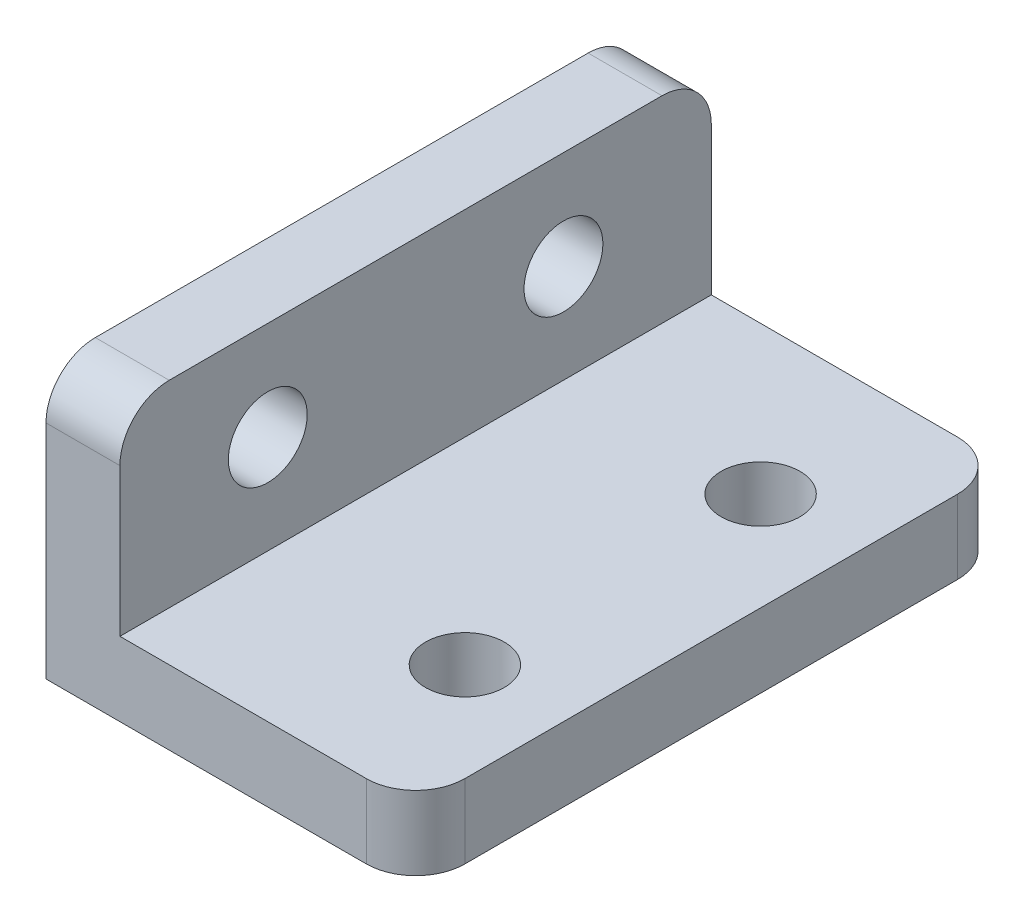
ISO-10303-21;
HEADER;
FILE_DESCRIPTION(('STEP AP214'),'2;1');
FILE_NAME('part.step','',(''),(''),'','','');
FILE_SCHEMA(('AUTOMOTIVE_DESIGN { 1 0 10303 214 1 1 1 1 }'));
ENDSEC;
DATA;
#1=APPLICATION_CONTEXT('core data for automotive mechanical design processes');
#2=APPLICATION_PROTOCOL_DEFINITION('international standard','automotive_design',2000,#1);
#3=PRODUCT_CONTEXT('',#1,'mechanical');
#4=PRODUCT('Part','Part','',(#3));
#5=PRODUCT_RELATED_PRODUCT_CATEGORY('part','',(#4));
#6=PRODUCT_DEFINITION_FORMATION('','',#4);
#7=PRODUCT_DEFINITION_CONTEXT('part definition',#1,'design');
#8=PRODUCT_DEFINITION('design','',#6,#7);
#9=PRODUCT_DEFINITION_SHAPE('','',#8);
#10=(LENGTH_UNIT() NAMED_UNIT(*) SI_UNIT(.MILLI.,.METRE.));
#11=(NAMED_UNIT(*) PLANE_ANGLE_UNIT() SI_UNIT($,.RADIAN.));
#12=(NAMED_UNIT(*) SI_UNIT($,.STERADIAN.) SOLID_ANGLE_UNIT());
#13=UNCERTAINTY_MEASURE_WITH_UNIT(LENGTH_MEASURE(1.E-05),#10,'distance_accuracy_value','');
#14=(GEOMETRIC_REPRESENTATION_CONTEXT(3) GLOBAL_UNCERTAINTY_ASSIGNED_CONTEXT((#13)) GLOBAL_UNIT_ASSIGNED_CONTEXT((#10,
#11,#12)) REPRESENTATION_CONTEXT('',''));
#15=CARTESIAN_POINT('',(0.,0.,0.));
#16=DIRECTION('',(0.,0.,1.));
#17=DIRECTION('',(1.,0.,0.));
#18=AXIS2_PLACEMENT_3D('',#15,#16,#17);
#19=CARTESIAN_POINT('',(9.40836507358763E-13,101.691622654979,-24.));
#20=DIRECTION('',(0.,-1.,0.));
#21=DIRECTION('',(1.,0.,0.));
#22=AXIS2_PLACEMENT_3D('',#19,#20,#21);
#23=PLANE('',#22);
#24=CARTESIAN_POINT('',(14.,101.691622654979,-6.));
#25=DIRECTION('',(0.,-1.,0.));
#26=DIRECTION('',(1.,0.,0.));
#27=AXIS2_PLACEMENT_3D('',#24,#25,#26);
#28=CIRCLE('',#27,1.60000000001785);
#29=CARTESIAN_POINT('',(15.6000000000178,101.691622654979,-6.));
#30=VERTEX_POINT('',#29);
#31=EDGE_CURVE('E369',#30,#30,#28,.T.);
#32=ORIENTED_EDGE('',*,*,#31,.F.);
#33=EDGE_LOOP('',(#32));
#34=FACE_BOUND('',#33,.T.);
#35=CARTESIAN_POINT('',(14.,101.691622654979,-18.));
#36=DIRECTION('',(0.,-1.,0.));
#37=DIRECTION('',(1.,0.,0.));
#38=AXIS2_PLACEMENT_3D('',#35,#36,#37);
#39=CIRCLE('',#38,1.60000000001785);
#40=CARTESIAN_POINT('',(15.6000000000178,101.691622654979,-18.));
#41=VERTEX_POINT('',#40);
#42=EDGE_CURVE('E374',#41,#41,#39,.T.);
#43=ORIENTED_EDGE('',*,*,#42,.F.);
#44=EDGE_LOOP('',(#43));
#45=FACE_BOUND('',#44,.T.);
#46=DIRECTION('',(1.,0.,0.));
#47=VECTOR('',#46,1.);
#48=CARTESIAN_POINT('',(9.40836507358763E-13,101.691622654979,-24.));
#49=LINE('',#48,#47);
#50=CARTESIAN_POINT('',(3.0000000000001,101.691622654979,-24.));
#51=VERTEX_POINT('',#50);
#52=CARTESIAN_POINT('',(16.,101.691622654979,-24.));
#53=VERTEX_POINT('',#52);
#54=EDGE_CURVE('E140',#51,#53,#49,.T.);
#55=ORIENTED_EDGE('',*,*,#54,.T.);
#56=CARTESIAN_POINT('',(16.,101.691622654979,-22.));
#57=DIRECTION('',(0.,-1.,0.));
#58=DIRECTION('',(1.,0.,0.));
#59=AXIS2_PLACEMENT_3D('',#56,#57,#58);
#60=CIRCLE('',#59,2.);
#61=CARTESIAN_POINT('',(18.,101.691622654979,-22.));
#62=VERTEX_POINT('',#61);
#63=EDGE_CURVE('E181',#53,#62,#60,.T.);
#64=ORIENTED_EDGE('',*,*,#63,.T.);
#65=DIRECTION('',(0.,0.,1.));
#66=VECTOR('',#65,1.);
#67=CARTESIAN_POINT('',(18.,101.691622654979,-24.));
#68=LINE('',#67,#66);
#69=CARTESIAN_POINT('',(18.,101.691622654979,-2.));
#70=VERTEX_POINT('',#69);
#71=EDGE_CURVE('E148',#62,#70,#68,.T.);
#72=ORIENTED_EDGE('',*,*,#71,.T.);
#73=CARTESIAN_POINT('',(16.,101.691622654979,-2.));
#74=DIRECTION('',(0.,-1.,0.));
#75=DIRECTION('',(1.,0.,0.));
#76=AXIS2_PLACEMENT_3D('',#73,#74,#75);
#77=CIRCLE('',#76,2.);
#78=CARTESIAN_POINT('',(16.,101.691622654979,0.));
#79=VERTEX_POINT('',#78);
#80=EDGE_CURVE('E179',#70,#79,#77,.T.);
#81=ORIENTED_EDGE('',*,*,#80,.T.);
#82=DIRECTION('',(1.,0.,0.));
#83=VECTOR('',#82,1.);
#84=CARTESIAN_POINT('',(9.40836507358763E-13,101.691622654979,0.));
#85=LINE('',#84,#83);
#86=CARTESIAN_POINT('',(3.0000000000001,101.691622654979,0.));
#87=VERTEX_POINT('',#86);
#88=EDGE_CURVE('E149',#87,#79,#85,.T.);
#89=ORIENTED_EDGE('',*,*,#88,.F.);
#90=DIRECTION('',(0.,0.,1.));
#91=VECTOR('',#90,1.);
#92=CARTESIAN_POINT('',(3.0000000000001,101.691622654979,-24.));
#93=LINE('',#92,#91);
#94=EDGE_CURVE('E157',#51,#87,#93,.T.);
#95=ORIENTED_EDGE('',*,*,#94,.F.);
#96=EDGE_LOOP('',(#55,#64,#72,#81,#89,#95));
#97=FACE_BOUND('',#96,.T.);
#98=ADVANCED_FACE('F36',(#34,#45,#97),#23,.T.);
#99=CARTESIAN_POINT('',(3.00000000000058,0.,-24.));
#100=DIRECTION('',(-1.,0.,0.));
#101=DIRECTION('',(0.,-1.,0.));
#102=AXIS2_PLACEMENT_3D('',#99,#100,#101);
#103=PLANE('',#102);
#104=CARTESIAN_POINT('',(3.00000000000007,108.691622654979,-6.));
#105=DIRECTION('',(-1.,0.,0.));
#106=DIRECTION('',(0.,-1.,0.));
#107=AXIS2_PLACEMENT_3D('',#104,#105,#106);
#108=CIRCLE('',#107,1.60000000000001);
#109=CARTESIAN_POINT('',(3.00000000000008,107.091622654979,-6.));
#110=VERTEX_POINT('',#109);
#111=EDGE_CURVE('E153',#110,#110,#108,.T.);
#112=ORIENTED_EDGE('',*,*,#111,.F.);
#113=EDGE_LOOP('',(#112));
#114=FACE_BOUND('',#113,.T.);
#115=CARTESIAN_POINT('',(3.00000000000007,108.691622654979,-18.));
#116=DIRECTION('',(-1.,0.,0.));
#117=DIRECTION('',(0.,-1.,0.));
#118=AXIS2_PLACEMENT_3D('',#115,#116,#117);
#119=CIRCLE('',#118,1.60000000000001);
#120=CARTESIAN_POINT('',(3.00000000000008,107.091622654979,-18.));
#121=VERTEX_POINT('',#120);
#122=EDGE_CURVE('E371',#121,#121,#119,.T.);
#123=ORIENTED_EDGE('',*,*,#122,.F.);
#124=EDGE_LOOP('',(#123));
#125=FACE_BOUND('',#124,.T.);
#126=DIRECTION('',(0.,0.,1.));
#127=VECTOR('',#126,1.);
#128=CARTESIAN_POINT('',(3.00000000000005,112.691622654979,-24.));
#129=LINE('',#128,#127);
#130=CARTESIAN_POINT('',(3.00000000000005,112.691622654979,-22.));
#131=VERTEX_POINT('',#130);
#132=CARTESIAN_POINT('',(3.00000000000005,112.691622654979,-2.));
#133=VERTEX_POINT('',#132);
#134=EDGE_CURVE('E161',#131,#133,#129,.T.);
#135=ORIENTED_EDGE('',*,*,#134,.F.);
#136=CARTESIAN_POINT('',(3.00000000000006,110.691622654979,-22.));
#137=DIRECTION('',(-1.,0.,0.));
#138=DIRECTION('',(0.,-1.,0.));
#139=AXIS2_PLACEMENT_3D('',#136,#137,#138);
#140=CIRCLE('',#139,2.);
#141=CARTESIAN_POINT('',(3.00000000000006,110.691622654979,-24.));
#142=VERTEX_POINT('',#141);
#143=EDGE_CURVE('E11',#131,#142,#140,.T.);
#144=ORIENTED_EDGE('',*,*,#143,.T.);
#145=DIRECTION('',(0.,-1.,0.));
#146=VECTOR('',#145,1.);
#147=CARTESIAN_POINT('',(3.00000000000058,0.,-24.));
#148=LINE('',#147,#146);
#149=EDGE_CURVE('E124',#142,#51,#148,.T.);
#150=ORIENTED_EDGE('',*,*,#149,.T.);
#151=ORIENTED_EDGE('',*,*,#94,.T.);
#152=DIRECTION('',(0.,-1.,0.));
#153=VECTOR('',#152,1.);
#154=CARTESIAN_POINT('',(3.00000000000058,0.,0.));
#155=LINE('',#154,#153);
#156=CARTESIAN_POINT('',(3.00000000000006,110.691622654979,0.));
#157=VERTEX_POINT('',#156);
#158=EDGE_CURVE('E143',#157,#87,#155,.T.);
#159=ORIENTED_EDGE('',*,*,#158,.F.);
#160=CARTESIAN_POINT('',(3.00000000000006,110.691622654979,-2.));
#161=DIRECTION('',(-1.,0.,0.));
#162=DIRECTION('',(0.,-1.,0.));
#163=AXIS2_PLACEMENT_3D('',#160,#161,#162);
#164=CIRCLE('',#163,2.);
#165=EDGE_CURVE('E44',#157,#133,#164,.T.);
#166=ORIENTED_EDGE('',*,*,#165,.T.);
#167=EDGE_LOOP('',(#135,#144,#150,#151,#159,#166));
#168=FACE_BOUND('',#167,.T.);
#169=ADVANCED_FACE('F201',(#114,#125,#168),#103,.T.);
#170=CARTESIAN_POINT('',(0.,112.691622654979,-24.));
#171=DIRECTION('',(0.,-1.,0.));
#172=DIRECTION('',(0.,0.,-1.));
#173=AXIS2_PLACEMENT_3D('',#170,#171,#172);
#174=PLANE('',#173);
#175=DIRECTION('',(0.,0.,1.));
#176=VECTOR('',#175,1.);
#177=CARTESIAN_POINT('',(6.00000000000005,112.691622654979,-24.));
#178=LINE('',#177,#176);
#179=CARTESIAN_POINT('',(6.00000000000005,112.691622654979,-22.));
#180=VERTEX_POINT('',#179);
#181=CARTESIAN_POINT('',(6.00000000000005,112.691622654979,-2.));
#182=VERTEX_POINT('',#181);
#183=EDGE_CURVE('E134',#180,#182,#178,.T.);
#184=ORIENTED_EDGE('',*,*,#183,.F.);
#185=DIRECTION('',(1.,0.,0.));
#186=VECTOR('',#185,1.);
#187=CARTESIAN_POINT('',(0.,112.691622654979,-22.));
#188=LINE('',#187,#186);
#189=EDGE_CURVE('E57',#180,#131,#188,.F.);
#190=ORIENTED_EDGE('',*,*,#189,.T.);
#191=ORIENTED_EDGE('',*,*,#134,.T.);
#192=DIRECTION('',(1.,0.,0.));
#193=VECTOR('',#192,1.);
#194=CARTESIAN_POINT('',(6.00000000000005,112.691622654979,-2.));
#195=LINE('',#194,#193);
#196=EDGE_CURVE('E192',#133,#182,#195,.T.);
#197=ORIENTED_EDGE('',*,*,#196,.T.);
#198=EDGE_LOOP('',(#184,#190,#191,#197));
#199=FACE_BOUND('',#198,.T.);
#200=ADVANCED_FACE('F196',(#199),#174,.F.);
#201=CARTESIAN_POINT('',(6.00000000000006,0.,-24.));
#202=DIRECTION('',(-1.,0.,0.));
#203=DIRECTION('',(0.,-1.,0.));
#204=AXIS2_PLACEMENT_3D('',#201,#202,#203);
#205=PLANE('',#204);
#206=CARTESIAN_POINT('',(6.00000000000005,108.691622654979,-6.));
#207=DIRECTION('',(1.,0.,0.));
#208=DIRECTION('',(0.,1.,0.));
#209=AXIS2_PLACEMENT_3D('',#206,#207,#208);
#210=CIRCLE('',#209,1.60000000000001);
#211=CARTESIAN_POINT('',(6.00000000000005,110.291622654979,-6.));
#212=VERTEX_POINT('',#211);
#213=EDGE_CURVE('E364',#212,#212,#210,.T.);
#214=ORIENTED_EDGE('',*,*,#213,.F.);
#215=EDGE_LOOP('',(#214));
#216=FACE_BOUND('',#215,.T.);
#217=CARTESIAN_POINT('',(6.00000000000005,108.691622654979,-18.));
#218=DIRECTION('',(1.,0.,0.));
#219=DIRECTION('',(0.,1.,0.));
#220=AXIS2_PLACEMENT_3D('',#217,#218,#219);
#221=CIRCLE('',#220,1.60000000000001);
#222=CARTESIAN_POINT('',(6.00000000000005,110.291622654979,-18.));
#223=VERTEX_POINT('',#222);
#224=EDGE_CURVE('E367',#223,#223,#221,.T.);
#225=ORIENTED_EDGE('',*,*,#224,.F.);
#226=EDGE_LOOP('',(#225));
#227=FACE_BOUND('',#226,.T.);
#228=DIRECTION('',(0.,-1.,0.));
#229=VECTOR('',#228,1.);
#230=CARTESIAN_POINT('',(6.00000000000006,0.,-24.));
#231=LINE('',#230,#229);
#232=CARTESIAN_POINT('',(6.00000000000005,110.691622654979,-24.));
#233=VERTEX_POINT('',#232);
#234=CARTESIAN_POINT('',(6.00000000000005,104.691622654979,-24.));
#235=VERTEX_POINT('',#234);
#236=EDGE_CURVE('E114',#233,#235,#231,.T.);
#237=ORIENTED_EDGE('',*,*,#236,.F.);
#238=CARTESIAN_POINT('',(6.00000000000005,110.691622654979,-22.));
#239=DIRECTION('',(-1.,0.,0.));
#240=DIRECTION('',(0.,-1.,0.));
#241=AXIS2_PLACEMENT_3D('',#238,#239,#240);
#242=CIRCLE('',#241,2.);
#243=EDGE_CURVE('E190',#233,#180,#242,.F.);
#244=ORIENTED_EDGE('',*,*,#243,.T.);
#245=ORIENTED_EDGE('',*,*,#183,.T.);
#246=CARTESIAN_POINT('',(6.00000000000005,110.691622654979,-2.));
#247=DIRECTION('',(-1.,0.,0.));
#248=DIRECTION('',(0.,-1.,0.));
#249=AXIS2_PLACEMENT_3D('',#246,#247,#248);
#250=CIRCLE('',#249,2.);
#251=CARTESIAN_POINT('',(6.00000000000005,110.691622654979,0.));
#252=VERTEX_POINT('',#251);
#253=EDGE_CURVE('E188',#182,#252,#250,.F.);
#254=ORIENTED_EDGE('',*,*,#253,.T.);
#255=DIRECTION('',(0.,-1.,0.));
#256=VECTOR('',#255,1.);
#257=CARTESIAN_POINT('',(6.00000000000006,0.,0.));
#258=LINE('',#257,#256);
#259=CARTESIAN_POINT('',(6.00000000000005,104.691622654979,0.));
#260=VERTEX_POINT('',#259);
#261=EDGE_CURVE('E130',#252,#260,#258,.T.);
#262=ORIENTED_EDGE('',*,*,#261,.T.);
#263=DIRECTION('',(0.,0.,1.));
#264=VECTOR('',#263,1.);
#265=CARTESIAN_POINT('',(6.00000000000005,104.691622654979,-24.));
#266=LINE('',#265,#264);
#267=EDGE_CURVE('E127',#235,#260,#266,.T.);
#268=ORIENTED_EDGE('',*,*,#267,.F.);
#269=EDGE_LOOP('',(#237,#244,#245,#254,#262,#268));
#270=FACE_BOUND('',#269,.T.);
#271=ADVANCED_FACE('F128',(#216,#227,#270),#205,.F.);
#272=CARTESIAN_POINT('',(0.,104.691622654979,-24.));
#273=DIRECTION('',(0.,-1.,0.));
#274=DIRECTION('',(0.,0.,-1.));
#275=AXIS2_PLACEMENT_3D('',#272,#273,#274);
#276=PLANE('',#275);
#277=CARTESIAN_POINT('',(14.,104.691622654979,-6.));
#278=DIRECTION('',(0.,1.,0.));
#279=DIRECTION('',(-1.,0.,0.));
#280=AXIS2_PLACEMENT_3D('',#277,#278,#279);
#281=CIRCLE('',#280,1.60000000001785);
#282=CARTESIAN_POINT('',(12.3999999999821,104.691622654979,-6.));
#283=VERTEX_POINT('',#282);
#284=EDGE_CURVE('E386',#283,#283,#281,.T.);
#285=ORIENTED_EDGE('',*,*,#284,.F.);
#286=EDGE_LOOP('',(#285));
#287=FACE_BOUND('',#286,.T.);
#288=CARTESIAN_POINT('',(14.,104.691622654979,-18.));
#289=DIRECTION('',(0.,1.,0.));
#290=DIRECTION('',(-1.,0.,0.));
#291=AXIS2_PLACEMENT_3D('',#288,#289,#290);
#292=CIRCLE('',#291,1.60000000001785);
#293=CARTESIAN_POINT('',(12.3999999999821,104.691622654979,-18.));
#294=VERTEX_POINT('',#293);
#295=EDGE_CURVE('E387',#294,#294,#292,.T.);
#296=ORIENTED_EDGE('',*,*,#295,.F.);
#297=EDGE_LOOP('',(#296));
#298=FACE_BOUND('',#297,.T.);
#299=DIRECTION('',(0.,0.,1.));
#300=VECTOR('',#299,1.);
#301=CARTESIAN_POINT('',(18.,104.691622654979,-24.));
#302=LINE('',#301,#300);
#303=CARTESIAN_POINT('',(18.,104.691622654979,-22.));
#304=VERTEX_POINT('',#303);
#305=CARTESIAN_POINT('',(18.,104.691622654979,-2.));
#306=VERTEX_POINT('',#305);
#307=EDGE_CURVE('E135',#304,#306,#302,.T.);
#308=ORIENTED_EDGE('',*,*,#307,.F.);
#309=CARTESIAN_POINT('',(16.,104.691622654979,-22.));
#310=DIRECTION('',(0.,-1.,0.));
#311=DIRECTION('',(0.,0.,-1.));
#312=AXIS2_PLACEMENT_3D('',#309,#310,#311);
#313=CIRCLE('',#312,2.);
#314=CARTESIAN_POINT('',(16.,104.691622654979,-24.));
#315=VERTEX_POINT('',#314);
#316=EDGE_CURVE('E139',#304,#315,#313,.F.);
#317=ORIENTED_EDGE('',*,*,#316,.T.);
#318=DIRECTION('',(1.,0.,0.));
#319=VECTOR('',#318,1.);
#320=CARTESIAN_POINT('',(0.,104.691622654979,-24.));
#321=LINE('',#320,#319);
#322=EDGE_CURVE('E118',#235,#315,#321,.T.);
#323=ORIENTED_EDGE('',*,*,#322,.F.);
#324=ORIENTED_EDGE('',*,*,#267,.T.);
#325=DIRECTION('',(1.,0.,0.));
#326=VECTOR('',#325,1.);
#327=CARTESIAN_POINT('',(0.,104.691622654979,0.));
#328=LINE('',#327,#326);
#329=CARTESIAN_POINT('',(16.,104.691622654979,0.));
#330=VERTEX_POINT('',#329);
#331=EDGE_CURVE('E152',#260,#330,#328,.T.);
#332=ORIENTED_EDGE('',*,*,#331,.T.);
#333=CARTESIAN_POINT('',(16.,104.691622654979,-2.));
#334=DIRECTION('',(0.,-1.,0.));
#335=DIRECTION('',(0.,0.,-1.));
#336=AXIS2_PLACEMENT_3D('',#333,#334,#335);
#337=CIRCLE('',#336,2.);
#338=EDGE_CURVE('E173',#330,#306,#337,.F.);
#339=ORIENTED_EDGE('',*,*,#338,.T.);
#340=EDGE_LOOP('',(#308,#317,#323,#324,#332,#339));
#341=FACE_BOUND('',#340,.T.);
#342=ADVANCED_FACE('F138',(#287,#298,#341),#276,.F.);
#343=CARTESIAN_POINT('',(18.,0.,-24.));
#344=DIRECTION('',(1.,0.,0.));
#345=DIRECTION('',(0.,0.,-1.));
#346=AXIS2_PLACEMENT_3D('',#343,#344,#345);
#347=PLANE('',#346);
#348=ORIENTED_EDGE('',*,*,#71,.F.);
#349=DIRECTION('',(0.,1.,0.));
#350=VECTOR('',#349,1.);
#351=CARTESIAN_POINT('',(18.,104.691622654979,-22.));
#352=LINE('',#351,#350);
#353=EDGE_CURVE('E170',#62,#304,#352,.T.);
#354=ORIENTED_EDGE('',*,*,#353,.T.);
#355=ORIENTED_EDGE('',*,*,#307,.T.);
#356=DIRECTION('',(0.,1.,0.));
#357=VECTOR('',#356,1.);
#358=CARTESIAN_POINT('',(18.,0.,-2.));
#359=LINE('',#358,#357);
#360=EDGE_CURVE('E160',#306,#70,#359,.F.);
#361=ORIENTED_EDGE('',*,*,#360,.T.);
#362=EDGE_LOOP('',(#348,#354,#355,#361));
#363=FACE_BOUND('',#362,.T.);
#364=ADVANCED_FACE('F212',(#363),#347,.T.);
#365=CARTESIAN_POINT('',(0.,0.,-24.));
#366=DIRECTION('',(0.,0.,1.));
#367=DIRECTION('',(1.,0.,0.));
#368=AXIS2_PLACEMENT_3D('',#365,#366,#367);
#369=PLANE('',#368);
#370=ORIENTED_EDGE('',*,*,#322,.T.);
#371=DIRECTION('',(0.,1.,0.));
#372=VECTOR('',#371,1.);
#373=CARTESIAN_POINT('',(16.,101.691622654979,-24.));
#374=LINE('',#373,#372);
#375=EDGE_CURVE('E177',#315,#53,#374,.F.);
#376=ORIENTED_EDGE('',*,*,#375,.T.);
#377=ORIENTED_EDGE('',*,*,#54,.F.);
#378=ORIENTED_EDGE('',*,*,#149,.F.);
#379=DIRECTION('',(1.,0.,0.));
#380=VECTOR('',#379,1.);
#381=CARTESIAN_POINT('',(0.,110.691622654979,-24.));
#382=LINE('',#381,#380);
#383=EDGE_CURVE('E122',#142,#233,#382,.T.);
#384=ORIENTED_EDGE('',*,*,#383,.T.);
#385=ORIENTED_EDGE('',*,*,#236,.T.);
#386=EDGE_LOOP('',(#370,#376,#377,#378,#384,#385));
#387=FACE_BOUND('',#386,.T.);
#388=ADVANCED_FACE('F116',(#387),#369,.F.);
#389=CARTESIAN_POINT('',(0.,0.,0.));
#390=DIRECTION('',(0.,0.,1.));
#391=DIRECTION('',(1.,0.,0.));
#392=AXIS2_PLACEMENT_3D('',#389,#390,#391);
#393=PLANE('',#392);
#394=ORIENTED_EDGE('',*,*,#88,.T.);
#395=DIRECTION('',(0.,1.,0.));
#396=VECTOR('',#395,1.);
#397=CARTESIAN_POINT('',(16.,0.,0.));
#398=LINE('',#397,#396);
#399=EDGE_CURVE('E185',#79,#330,#398,.T.);
#400=ORIENTED_EDGE('',*,*,#399,.T.);
#401=ORIENTED_EDGE('',*,*,#331,.F.);
#402=ORIENTED_EDGE('',*,*,#261,.F.);
#403=DIRECTION('',(1.,0.,0.));
#404=VECTOR('',#403,1.);
#405=CARTESIAN_POINT('',(3.00000000000005,110.691622654979,0.));
#406=LINE('',#405,#404);
#407=EDGE_CURVE('E183',#252,#157,#406,.F.);
#408=ORIENTED_EDGE('',*,*,#407,.T.);
#409=ORIENTED_EDGE('',*,*,#158,.T.);
#410=EDGE_LOOP('',(#394,#400,#401,#402,#408,#409));
#411=FACE_BOUND('',#410,.T.);
#412=ADVANCED_FACE('F219',(#411),#393,.T.);
#413=CARTESIAN_POINT('',(-18.,108.691622654979,-18.));
#414=DIRECTION('',(1.,0.,0.));
#415=DIRECTION('',(0.,1.,0.));
#416=AXIS2_PLACEMENT_3D('',#413,#414,#415);
#417=CYLINDRICAL_SURFACE('',#416,1.60000000000001);
#418=ORIENTED_EDGE('',*,*,#122,.T.);
#419=EDGE_LOOP('',(#418));
#420=FACE_BOUND('',#419,.T.);
#421=ORIENTED_EDGE('',*,*,#224,.T.);
#422=EDGE_LOOP('',(#421));
#423=FACE_BOUND('',#422,.T.);
#424=ADVANCED_FACE('F289',(#420,#423),#417,.F.);
#425=CARTESIAN_POINT('',(-18.,108.691622654979,-6.));
#426=DIRECTION('',(1.,0.,0.));
#427=DIRECTION('',(0.,1.,0.));
#428=AXIS2_PLACEMENT_3D('',#425,#426,#427);
#429=CYLINDRICAL_SURFACE('',#428,1.60000000000001);
#430=ORIENTED_EDGE('',*,*,#111,.T.);
#431=EDGE_LOOP('',(#430));
#432=FACE_BOUND('',#431,.T.);
#433=ORIENTED_EDGE('',*,*,#213,.T.);
#434=EDGE_LOOP('',(#433));
#435=FACE_BOUND('',#434,.T.);
#436=ADVANCED_FACE('F280',(#432,#435),#429,.F.);
#437=CARTESIAN_POINT('',(14.,80.6916226549791,-18.));
#438=DIRECTION('',(0.,1.,0.));
#439=DIRECTION('',(-1.,0.,0.));
#440=AXIS2_PLACEMENT_3D('',#437,#438,#439);
#441=CYLINDRICAL_SURFACE('',#440,1.60000000001785);
#442=ORIENTED_EDGE('',*,*,#42,.T.);
#443=EDGE_LOOP('',(#442));
#444=FACE_BOUND('',#443,.T.);
#445=ORIENTED_EDGE('',*,*,#295,.T.);
#446=EDGE_LOOP('',(#445));
#447=FACE_BOUND('',#446,.T.);
#448=ADVANCED_FACE('F271',(#444,#447),#441,.F.);
#449=CARTESIAN_POINT('',(14.,80.6916226549791,-6.));
#450=DIRECTION('',(0.,1.,0.));
#451=DIRECTION('',(-1.,0.,0.));
#452=AXIS2_PLACEMENT_3D('',#449,#450,#451);
#453=CYLINDRICAL_SURFACE('',#452,1.60000000001785);
#454=ORIENTED_EDGE('',*,*,#31,.T.);
#455=EDGE_LOOP('',(#454));
#456=FACE_BOUND('',#455,.T.);
#457=ORIENTED_EDGE('',*,*,#284,.T.);
#458=EDGE_LOOP('',(#457));
#459=FACE_BOUND('',#458,.T.);
#460=ADVANCED_FACE('F240',(#456,#459),#453,.F.);
#461=CARTESIAN_POINT('',(16.,0.,-22.));
#462=DIRECTION('',(0.,-1.,0.));
#463=DIRECTION('',(0.,0.,-1.));
#464=AXIS2_PLACEMENT_3D('',#461,#462,#463);
#465=CYLINDRICAL_SURFACE('',#464,2.);
#466=ORIENTED_EDGE('',*,*,#63,.F.);
#467=ORIENTED_EDGE('',*,*,#375,.F.);
#468=ORIENTED_EDGE('',*,*,#316,.F.);
#469=ORIENTED_EDGE('',*,*,#353,.F.);
#470=EDGE_LOOP('',(#466,#467,#468,#469));
#471=FACE_BOUND('',#470,.T.);
#472=ADVANCED_FACE('F210',(#471),#465,.T.);
#473=CARTESIAN_POINT('',(16.,0.,-2.));
#474=DIRECTION('',(0.,1.,0.));
#475=DIRECTION('',(0.,0.,1.));
#476=AXIS2_PLACEMENT_3D('',#473,#474,#475);
#477=CYLINDRICAL_SURFACE('',#476,2.);
#478=ORIENTED_EDGE('',*,*,#80,.F.);
#479=ORIENTED_EDGE('',*,*,#360,.F.);
#480=ORIENTED_EDGE('',*,*,#338,.F.);
#481=ORIENTED_EDGE('',*,*,#399,.F.);
#482=EDGE_LOOP('',(#478,#479,#480,#481));
#483=FACE_BOUND('',#482,.T.);
#484=ADVANCED_FACE('F217',(#483),#477,.T.);
#485=CARTESIAN_POINT('',(0.,110.691622654979,-22.));
#486=DIRECTION('',(1.,0.,0.));
#487=DIRECTION('',(0.,0.,-1.));
#488=AXIS2_PLACEMENT_3D('',#485,#486,#487);
#489=CYLINDRICAL_SURFACE('',#488,2.);
#490=ORIENTED_EDGE('',*,*,#143,.F.);
#491=ORIENTED_EDGE('',*,*,#189,.F.);
#492=ORIENTED_EDGE('',*,*,#243,.F.);
#493=ORIENTED_EDGE('',*,*,#383,.F.);
#494=EDGE_LOOP('',(#490,#491,#492,#493));
#495=FACE_BOUND('',#494,.T.);
#496=ADVANCED_FACE('F200',(#495),#489,.T.);
#497=CARTESIAN_POINT('',(0.,110.691622654979,-2.));
#498=DIRECTION('',(-1.,0.,0.));
#499=DIRECTION('',(0.,0.,1.));
#500=AXIS2_PLACEMENT_3D('',#497,#498,#499);
#501=CYLINDRICAL_SURFACE('',#500,2.);
#502=ORIENTED_EDGE('',*,*,#165,.F.);
#503=ORIENTED_EDGE('',*,*,#407,.F.);
#504=ORIENTED_EDGE('',*,*,#253,.F.);
#505=ORIENTED_EDGE('',*,*,#196,.F.);
#506=EDGE_LOOP('',(#502,#503,#504,#505));
#507=FACE_BOUND('',#506,.T.);
#508=ADVANCED_FACE('F38',(#507),#501,.T.);
#509=CLOSED_SHELL('',(#98,#169,#200,#271,#342,#364,#388,#412,#424,#436,#448,#460,#472,#484,#496,#508));
#510=MANIFOLD_SOLID_BREP('B2',#509);
#511=ADVANCED_BREP_SHAPE_REPRESENTATION('',(#18,#510),#14);
#512=SHAPE_DEFINITION_REPRESENTATION(#9,#511);
ENDSEC;
END-ISO-10303-21;
